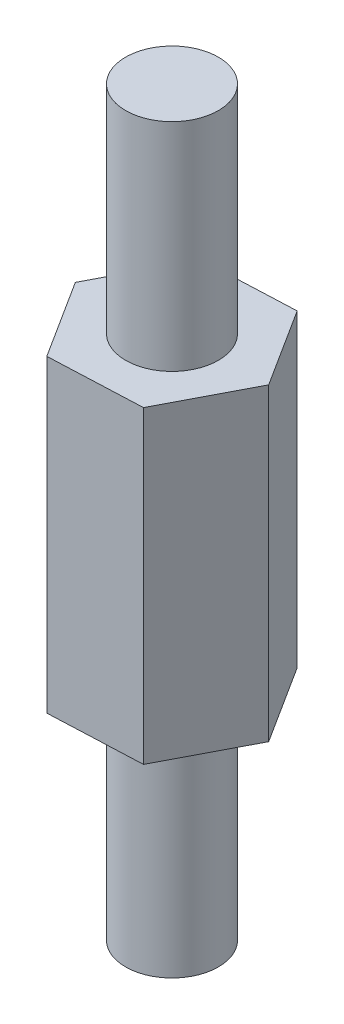
ISO-10303-21;
HEADER;
FILE_DESCRIPTION(('STEP AP214'),'2;1');
FILE_NAME('part.step','',(''),(''),'','','');
FILE_SCHEMA(('AUTOMOTIVE_DESIGN { 1 0 10303 214 1 1 1 1 }'));
ENDSEC;
DATA;
#1=APPLICATION_CONTEXT('core data for automotive mechanical design processes');
#2=APPLICATION_PROTOCOL_DEFINITION('international standard','automotive_design',2000,#1);
#3=PRODUCT_CONTEXT('',#1,'mechanical');
#4=PRODUCT('Part','Part','',(#3));
#5=PRODUCT_RELATED_PRODUCT_CATEGORY('part','',(#4));
#6=PRODUCT_DEFINITION_FORMATION('','',#4);
#7=PRODUCT_DEFINITION_CONTEXT('part definition',#1,'design');
#8=PRODUCT_DEFINITION('design','',#6,#7);
#9=PRODUCT_DEFINITION_SHAPE('','',#8);
#10=(LENGTH_UNIT() NAMED_UNIT(*) SI_UNIT(.MILLI.,.METRE.));
#11=(NAMED_UNIT(*) PLANE_ANGLE_UNIT() SI_UNIT($,.RADIAN.));
#12=(NAMED_UNIT(*) SI_UNIT($,.STERADIAN.) SOLID_ANGLE_UNIT());
#13=UNCERTAINTY_MEASURE_WITH_UNIT(LENGTH_MEASURE(1.E-05),#10,'distance_accuracy_value','');
#14=(GEOMETRIC_REPRESENTATION_CONTEXT(3) GLOBAL_UNCERTAINTY_ASSIGNED_CONTEXT((#13)) GLOBAL_UNIT_ASSIGNED_CONTEXT((#10,
#11,#12)) REPRESENTATION_CONTEXT('',''));
#15=CARTESIAN_POINT('',(0.,0.,0.));
#16=DIRECTION('',(0.,0.,1.));
#17=DIRECTION('',(1.,0.,0.));
#18=AXIS2_PLACEMENT_3D('',#15,#16,#17);
#19=CARTESIAN_POINT('',(0.,0.,0.));
#20=DIRECTION('',(0.,1.,0.));
#21=DIRECTION('',(0.,0.,1.));
#22=AXIS2_PLACEMENT_3D('',#19,#20,#21);
#23=PLANE('',#22);
#24=DIRECTION('',(-0.536521996042108,0.,-0.843886335807727));
#25=VECTOR('',#24,1.);
#26=CARTESIAN_POINT('',(3.,0.,-0.12821246048624));
#27=LINE('',#26,#25);
#28=CARTESIAN_POINT('',(3.,0.,-0.12821246048624));
#29=VERTEX_POINT('',#28);
#30=CARTESIAN_POINT('',(1.38896475213721,0.,-2.66218244159644));
#31=VERTEX_POINT('',#30);
#32=EDGE_CURVE('E119',#29,#31,#27,.T.);
#33=ORIENTED_EDGE('',*,*,#32,.F.);
#34=DIRECTION('',(0.462566006695003,0.,-0.886584846165463));
#35=VECTOR('',#34,1.);
#36=CARTESIAN_POINT('',(1.61103524786279,0.,2.5339699811102));
#37=LINE('',#36,#35);
#38=CARTESIAN_POINT('',(1.61103524786279,0.,2.5339699811102));
#39=VERTEX_POINT('',#38);
#40=EDGE_CURVE('E78',#39,#29,#37,.T.);
#41=ORIENTED_EDGE('',*,*,#40,.F.);
#42=DIRECTION('',(0.999088002737111,0.,-0.0426985103577362));
#43=VECTOR('',#42,1.);
#44=CARTESIAN_POINT('',(-1.38896475213721,0.,2.66218244159644));
#45=LINE('',#44,#43);
#46=CARTESIAN_POINT('',(-1.38896475213721,0.,2.66218244159644));
#47=VERTEX_POINT('',#46);
#48=EDGE_CURVE('E72',#47,#39,#45,.T.);
#49=ORIENTED_EDGE('',*,*,#48,.F.);
#50=DIRECTION('',(0.536521996042108,0.,0.843886335807727));
#51=VECTOR('',#50,1.);
#52=CARTESIAN_POINT('',(-3.,0.,0.12821246048624));
#53=LINE('',#52,#51);
#54=CARTESIAN_POINT('',(-3.,0.,0.12821246048624));
#55=VERTEX_POINT('',#54);
#56=EDGE_CURVE('E109',#55,#47,#53,.T.);
#57=ORIENTED_EDGE('',*,*,#56,.F.);
#58=DIRECTION('',(-0.462566006695003,0.,0.886584846165463));
#59=VECTOR('',#58,1.);
#60=CARTESIAN_POINT('',(-1.61103524786279,0.,-2.5339699811102));
#61=LINE('',#60,#59);
#62=CARTESIAN_POINT('',(-1.61103524786279,0.,-2.5339699811102));
#63=VERTEX_POINT('',#62);
#64=EDGE_CURVE('E125',#63,#55,#61,.T.);
#65=ORIENTED_EDGE('',*,*,#64,.F.);
#66=DIRECTION('',(-0.999088002737111,0.,0.0426985103577361));
#67=VECTOR('',#66,1.);
#68=CARTESIAN_POINT('',(1.38896475213721,0.,-2.66218244159644));
#69=LINE('',#68,#67);
#70=EDGE_CURVE('E122',#31,#63,#69,.T.);
#71=ORIENTED_EDGE('',*,*,#70,.F.);
#72=EDGE_LOOP('',(#33,#41,#49,#57,#65,#71));
#73=FACE_BOUND('',#72,.T.);
#74=CARTESIAN_POINT('',(0.,0.,0.));
#75=DIRECTION('',(0.,1.,0.));
#76=DIRECTION('',(0.,0.,1.));
#77=AXIS2_PLACEMENT_3D('',#74,#75,#76);
#78=CIRCLE('',#77,1.5);
#79=CARTESIAN_POINT('',(0.,0.,1.5));
#80=VERTEX_POINT('',#79);
#81=EDGE_CURVE('E11',#80,#80,#78,.F.);
#82=ORIENTED_EDGE('',*,*,#81,.F.);
#83=EDGE_LOOP('',(#82));
#84=FACE_BOUND('',#83,.T.);
#85=ADVANCED_FACE('F32',(#73,#84),#23,.F.);
#86=CARTESIAN_POINT('',(0.,10.,0.));
#87=DIRECTION('',(0.,1.,0.));
#88=DIRECTION('',(0.,0.,1.));
#89=AXIS2_PLACEMENT_3D('',#86,#87,#88);
#90=PLANE('',#89);
#91=DIRECTION('',(-0.536521996042108,0.,-0.843886335807727));
#92=VECTOR('',#91,1.);
#93=CARTESIAN_POINT('',(3.,10.,-0.12821246048624));
#94=LINE('',#93,#92);
#95=CARTESIAN_POINT('',(3.,10.,-0.12821246048624));
#96=VERTEX_POINT('',#95);
#97=CARTESIAN_POINT('',(1.38896475213721,10.,-2.66218244159644));
#98=VERTEX_POINT('',#97);
#99=EDGE_CURVE('E130',#96,#98,#94,.T.);
#100=ORIENTED_EDGE('',*,*,#99,.T.);
#101=DIRECTION('',(-0.999088002737111,0.,0.0426985103577361));
#102=VECTOR('',#101,1.);
#103=CARTESIAN_POINT('',(1.38896475213721,10.,-2.66218244159644));
#104=LINE('',#103,#102);
#105=CARTESIAN_POINT('',(-1.61103524786279,10.,-2.5339699811102));
#106=VERTEX_POINT('',#105);
#107=EDGE_CURVE('E87',#98,#106,#104,.T.);
#108=ORIENTED_EDGE('',*,*,#107,.T.);
#109=DIRECTION('',(-0.462566006695003,0.,0.886584846165463));
#110=VECTOR('',#109,1.);
#111=CARTESIAN_POINT('',(-1.61103524786279,10.,-2.5339699811102));
#112=LINE('',#111,#110);
#113=CARTESIAN_POINT('',(-3.,10.,0.12821246048624));
#114=VERTEX_POINT('',#113);
#115=EDGE_CURVE('E101',#106,#114,#112,.T.);
#116=ORIENTED_EDGE('',*,*,#115,.T.);
#117=DIRECTION('',(0.536521996042108,0.,0.843886335807727));
#118=VECTOR('',#117,1.);
#119=CARTESIAN_POINT('',(-3.,10.,0.12821246048624));
#120=LINE('',#119,#118);
#121=CARTESIAN_POINT('',(-1.38896475213721,10.,2.66218244159644));
#122=VERTEX_POINT('',#121);
#123=EDGE_CURVE('E94',#114,#122,#120,.T.);
#124=ORIENTED_EDGE('',*,*,#123,.T.);
#125=DIRECTION('',(0.999088002737111,0.,-0.0426985103577362));
#126=VECTOR('',#125,1.);
#127=CARTESIAN_POINT('',(-1.38896475213721,10.,2.66218244159644));
#128=LINE('',#127,#126);
#129=CARTESIAN_POINT('',(1.61103524786279,10.,2.5339699811102));
#130=VERTEX_POINT('',#129);
#131=EDGE_CURVE('E99',#122,#130,#128,.T.);
#132=ORIENTED_EDGE('',*,*,#131,.T.);
#133=DIRECTION('',(0.462566006695003,0.,-0.886584846165463));
#134=VECTOR('',#133,1.);
#135=CARTESIAN_POINT('',(1.61103524786279,10.,2.5339699811102));
#136=LINE('',#135,#134);
#137=EDGE_CURVE('E49',#130,#96,#136,.T.);
#138=ORIENTED_EDGE('',*,*,#137,.T.);
#139=EDGE_LOOP('',(#100,#108,#116,#124,#132,#138));
#140=FACE_BOUND('',#139,.T.);
#141=CARTESIAN_POINT('',(0.,10.,0.));
#142=DIRECTION('',(0.,1.,0.));
#143=DIRECTION('',(0.,0.,1.));
#144=AXIS2_PLACEMENT_3D('',#141,#142,#143);
#145=CIRCLE('',#144,1.5);
#146=CARTESIAN_POINT('',(0.,10.,1.5));
#147=VERTEX_POINT('',#146);
#148=EDGE_CURVE('E149',#147,#147,#145,.T.);
#149=ORIENTED_EDGE('',*,*,#148,.F.);
#150=EDGE_LOOP('',(#149));
#151=FACE_BOUND('',#150,.T.);
#152=ADVANCED_FACE('F96',(#140,#151),#90,.T.);
#153=CARTESIAN_POINT('',(3.,10.,-0.12821246048624));
#154=DIRECTION('',(-0.843886335807727,0.,0.536521996042108));
#155=DIRECTION('',(0.536521996042108,0.,0.843886335807727));
#156=AXIS2_PLACEMENT_3D('',#153,#154,#155);
#157=PLANE('',#156);
#158=ORIENTED_EDGE('',*,*,#32,.T.);
#159=DIRECTION('',(0.,-1.,0.));
#160=VECTOR('',#159,1.);
#161=CARTESIAN_POINT('',(1.38896475213721,10.,-2.66218244159644));
#162=LINE('',#161,#160);
#163=EDGE_CURVE('E41',#98,#31,#162,.T.);
#164=ORIENTED_EDGE('',*,*,#163,.F.);
#165=ORIENTED_EDGE('',*,*,#99,.F.);
#166=DIRECTION('',(0.,-1.,0.));
#167=VECTOR('',#166,1.);
#168=CARTESIAN_POINT('',(3.,10.,-0.12821246048624));
#169=LINE('',#168,#167);
#170=EDGE_CURVE('E115',#96,#29,#169,.T.);
#171=ORIENTED_EDGE('',*,*,#170,.T.);
#172=EDGE_LOOP('',(#158,#164,#165,#171));
#173=FACE_BOUND('',#172,.T.);
#174=ADVANCED_FACE('F34',(#173),#157,.F.);
#175=CARTESIAN_POINT('',(1.38896475213721,10.,-2.66218244159644));
#176=DIRECTION('',(0.0426985103577361,0.,0.999088002737112));
#177=DIRECTION('',(0.999088002737112,0.,-0.0426985103577361));
#178=AXIS2_PLACEMENT_3D('',#175,#176,#177);
#179=PLANE('',#178);
#180=ORIENTED_EDGE('',*,*,#70,.T.);
#181=DIRECTION('',(0.,-1.,0.));
#182=VECTOR('',#181,1.);
#183=CARTESIAN_POINT('',(-1.61103524786279,10.,-2.5339699811102));
#184=LINE('',#183,#182);
#185=EDGE_CURVE('E134',#106,#63,#184,.T.);
#186=ORIENTED_EDGE('',*,*,#185,.F.);
#187=ORIENTED_EDGE('',*,*,#107,.F.);
#188=ORIENTED_EDGE('',*,*,#163,.T.);
#189=EDGE_LOOP('',(#180,#186,#187,#188));
#190=FACE_BOUND('',#189,.T.);
#191=ADVANCED_FACE('F137',(#190),#179,.F.);
#192=CARTESIAN_POINT('',(-1.61103524786279,10.,-2.5339699811102));
#193=DIRECTION('',(0.886584846165463,0.,0.462566006695003));
#194=DIRECTION('',(0.462566006695003,0.,-0.886584846165463));
#195=AXIS2_PLACEMENT_3D('',#192,#193,#194);
#196=PLANE('',#195);
#197=ORIENTED_EDGE('',*,*,#64,.T.);
#198=DIRECTION('',(0.,-1.,0.));
#199=VECTOR('',#198,1.);
#200=CARTESIAN_POINT('',(-3.,10.,0.12821246048624));
#201=LINE('',#200,#199);
#202=EDGE_CURVE('E110',#114,#55,#201,.T.);
#203=ORIENTED_EDGE('',*,*,#202,.F.);
#204=ORIENTED_EDGE('',*,*,#115,.F.);
#205=ORIENTED_EDGE('',*,*,#185,.T.);
#206=EDGE_LOOP('',(#197,#203,#204,#205));
#207=FACE_BOUND('',#206,.T.);
#208=ADVANCED_FACE('F145',(#207),#196,.F.);
#209=CARTESIAN_POINT('',(-3.,10.,0.12821246048624));
#210=DIRECTION('',(0.843886335807727,0.,-0.536521996042108));
#211=DIRECTION('',(-0.536521996042108,0.,-0.843886335807727));
#212=AXIS2_PLACEMENT_3D('',#209,#210,#211);
#213=PLANE('',#212);
#214=ORIENTED_EDGE('',*,*,#56,.T.);
#215=DIRECTION('',(0.,-1.,0.));
#216=VECTOR('',#215,1.);
#217=CARTESIAN_POINT('',(-1.38896475213721,10.,2.66218244159644));
#218=LINE('',#217,#216);
#219=EDGE_CURVE('E106',#122,#47,#218,.T.);
#220=ORIENTED_EDGE('',*,*,#219,.F.);
#221=ORIENTED_EDGE('',*,*,#123,.F.);
#222=ORIENTED_EDGE('',*,*,#202,.T.);
#223=EDGE_LOOP('',(#214,#220,#221,#222));
#224=FACE_BOUND('',#223,.T.);
#225=ADVANCED_FACE('F107',(#224),#213,.F.);
#226=CARTESIAN_POINT('',(-1.38896475213721,10.,2.66218244159644));
#227=DIRECTION('',(-0.0426985103577362,0.,-0.999088002737111));
#228=DIRECTION('',(-0.999088002737111,0.,0.0426985103577362));
#229=AXIS2_PLACEMENT_3D('',#226,#227,#228);
#230=PLANE('',#229);
#231=ORIENTED_EDGE('',*,*,#48,.T.);
#232=DIRECTION('',(0.,-1.,0.));
#233=VECTOR('',#232,1.);
#234=CARTESIAN_POINT('',(1.61103524786279,10.,2.5339699811102));
#235=LINE('',#234,#233);
#236=EDGE_CURVE('E111',#130,#39,#235,.T.);
#237=ORIENTED_EDGE('',*,*,#236,.F.);
#238=ORIENTED_EDGE('',*,*,#131,.F.);
#239=ORIENTED_EDGE('',*,*,#219,.T.);
#240=EDGE_LOOP('',(#231,#237,#238,#239));
#241=FACE_BOUND('',#240,.T.);
#242=ADVANCED_FACE('F113',(#241),#230,.F.);
#243=CARTESIAN_POINT('',(1.61103524786279,10.,2.5339699811102));
#244=DIRECTION('',(-0.886584846165463,0.,-0.462566006695003));
#245=DIRECTION('',(-0.462566006695003,0.,0.886584846165463));
#246=AXIS2_PLACEMENT_3D('',#243,#244,#245);
#247=PLANE('',#246);
#248=ORIENTED_EDGE('',*,*,#40,.T.);
#249=ORIENTED_EDGE('',*,*,#170,.F.);
#250=ORIENTED_EDGE('',*,*,#137,.F.);
#251=ORIENTED_EDGE('',*,*,#236,.T.);
#252=EDGE_LOOP('',(#248,#249,#250,#251));
#253=FACE_BOUND('',#252,.T.);
#254=ADVANCED_FACE('F174',(#253),#247,.F.);
#255=CARTESIAN_POINT('',(0.,17.,0.));
#256=DIRECTION('',(0.,-1.,0.));
#257=DIRECTION('',(0.,0.,-1.));
#258=AXIS2_PLACEMENT_3D('',#255,#256,#257);
#259=CYLINDRICAL_SURFACE('',#258,1.5);
#260=CARTESIAN_POINT('',(0.,17.,0.));
#261=DIRECTION('',(0.,1.,0.));
#262=DIRECTION('',(0.,0.,1.));
#263=AXIS2_PLACEMENT_3D('',#260,#261,#262);
#264=CIRCLE('',#263,1.5);
#265=CARTESIAN_POINT('',(0.,17.,1.5));
#266=VERTEX_POINT('',#265);
#267=EDGE_CURVE('E123',#266,#266,#264,.T.);
#268=ORIENTED_EDGE('',*,*,#267,.F.);
#269=EDGE_LOOP('',(#268));
#270=FACE_BOUND('',#269,.T.);
#271=ORIENTED_EDGE('',*,*,#148,.T.);
#272=EDGE_LOOP('',(#271));
#273=FACE_BOUND('',#272,.T.);
#274=ADVANCED_FACE('F177',(#270,#273),#259,.T.);
#275=CARTESIAN_POINT('',(0.,17.,0.));
#276=DIRECTION('',(0.,1.,0.));
#277=DIRECTION('',(0.,0.,1.));
#278=AXIS2_PLACEMENT_3D('',#275,#276,#277);
#279=PLANE('',#278);
#280=ORIENTED_EDGE('',*,*,#267,.T.);
#281=EDGE_LOOP('',(#280));
#282=FACE_BOUND('',#281,.T.);
#283=ADVANCED_FACE('F163',(#282),#279,.T.);
#284=CARTESIAN_POINT('',(0.,-7.,0.));
#285=DIRECTION('',(0.,1.,0.));
#286=DIRECTION('',(0.,0.,1.));
#287=AXIS2_PLACEMENT_3D('',#284,#285,#286);
#288=CYLINDRICAL_SURFACE('',#287,1.5);
#289=CARTESIAN_POINT('',(0.,-7.,0.));
#290=DIRECTION('',(0.,-1.,0.));
#291=DIRECTION('',(0.,0.,-1.));
#292=AXIS2_PLACEMENT_3D('',#289,#290,#291);
#293=CIRCLE('',#292,1.5);
#294=CARTESIAN_POINT('',(0.,-7.,-1.5));
#295=VERTEX_POINT('',#294);
#296=EDGE_CURVE('E152',#295,#295,#293,.T.);
#297=ORIENTED_EDGE('',*,*,#296,.F.);
#298=EDGE_LOOP('',(#297));
#299=FACE_BOUND('',#298,.T.);
#300=ORIENTED_EDGE('',*,*,#81,.T.);
#301=EDGE_LOOP('',(#300));
#302=FACE_BOUND('',#301,.T.);
#303=ADVANCED_FACE('F160',(#299,#302),#288,.T.);
#304=CARTESIAN_POINT('',(0.,-7.,0.));
#305=DIRECTION('',(0.,-1.,0.));
#306=DIRECTION('',(0.,0.,-1.));
#307=AXIS2_PLACEMENT_3D('',#304,#305,#306);
#308=PLANE('',#307);
#309=ORIENTED_EDGE('',*,*,#296,.T.);
#310=EDGE_LOOP('',(#309));
#311=FACE_BOUND('',#310,.T.);
#312=ADVANCED_FACE('F158',(#311),#308,.T.);
#313=CLOSED_SHELL('',(#85,#152,#174,#191,#208,#225,#242,#254,#274,#283,#303,#312));
#314=MANIFOLD_SOLID_BREP('B2',#313);
#315=ADVANCED_BREP_SHAPE_REPRESENTATION('',(#18,#314),#14);
#316=SHAPE_DEFINITION_REPRESENTATION(#9,#315);
ENDSEC;
END-ISO-10303-21;
